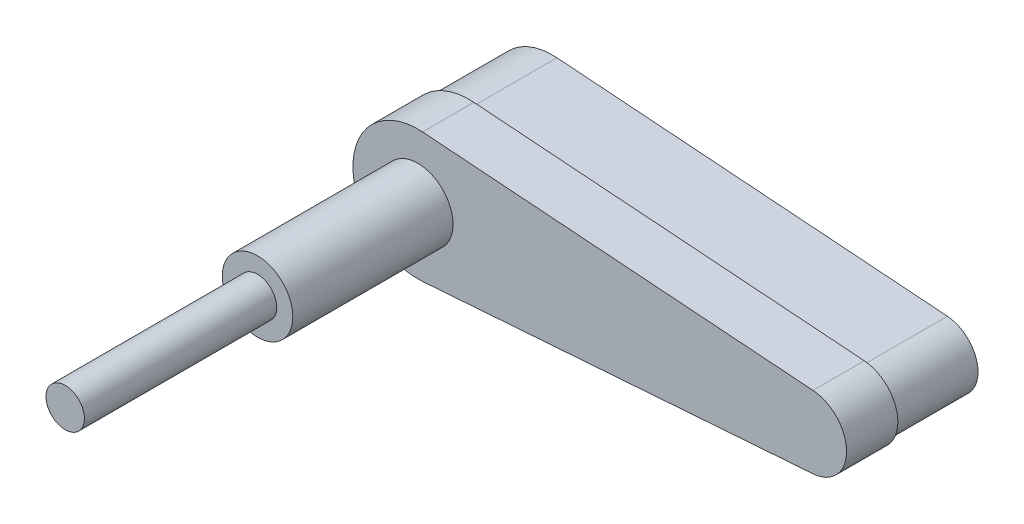
ISO-10303-21;
HEADER;
FILE_DESCRIPTION(('STEP AP214'),'2;1');
FILE_NAME('part.step','',(''),(''),'','','');
FILE_SCHEMA(('AUTOMOTIVE_DESIGN { 1 0 10303 214 1 1 1 1 }'));
ENDSEC;
DATA;
#1=APPLICATION_CONTEXT('core data for automotive mechanical design processes');
#2=APPLICATION_PROTOCOL_DEFINITION('international standard','automotive_design',2000,#1);
#3=PRODUCT_CONTEXT('',#1,'mechanical');
#4=PRODUCT('Part','Part','',(#3));
#5=PRODUCT_RELATED_PRODUCT_CATEGORY('part','',(#4));
#6=PRODUCT_DEFINITION_FORMATION('','',#4);
#7=PRODUCT_DEFINITION_CONTEXT('part definition',#1,'design');
#8=PRODUCT_DEFINITION('design','',#6,#7);
#9=PRODUCT_DEFINITION_SHAPE('','',#8);
#10=(LENGTH_UNIT() NAMED_UNIT(*) SI_UNIT(.MILLI.,.METRE.));
#11=(NAMED_UNIT(*) PLANE_ANGLE_UNIT() SI_UNIT($,.RADIAN.));
#12=(NAMED_UNIT(*) SI_UNIT($,.STERADIAN.) SOLID_ANGLE_UNIT());
#13=UNCERTAINTY_MEASURE_WITH_UNIT(LENGTH_MEASURE(1.E-05),#10,'distance_accuracy_value','');
#14=(GEOMETRIC_REPRESENTATION_CONTEXT(3) GLOBAL_UNCERTAINTY_ASSIGNED_CONTEXT((#13)) GLOBAL_UNIT_ASSIGNED_CONTEXT((#10,
#11,#12)) REPRESENTATION_CONTEXT('',''));
#15=CARTESIAN_POINT('',(0.,0.,0.));
#16=DIRECTION('',(0.,0.,1.));
#17=DIRECTION('',(1.,0.,0.));
#18=AXIS2_PLACEMENT_3D('',#15,#16,#17);
#19=CARTESIAN_POINT('',(9.62576122381982,0.,76.));
#20=DIRECTION('',(0.,0.,-1.));
#21=DIRECTION('',(-1.,0.,0.));
#22=AXIS2_PLACEMENT_3D('',#19,#20,#21);
#23=CYLINDRICAL_SURFACE('',#22,5.5);
#24=CARTESIAN_POINT('',(9.62576122381982,0.,21.));
#25=DIRECTION('',(0.,0.,1.));
#26=DIRECTION('',(1.,0.,0.));
#27=AXIS2_PLACEMENT_3D('',#24,#25,#26);
#28=CIRCLE('',#27,5.5);
#29=CARTESIAN_POINT('',(15.1257612238198,0.,21.));
#30=VERTEX_POINT('',#29);
#31=EDGE_CURVE('E211',#30,#30,#28,.T.);
#32=ORIENTED_EDGE('',*,*,#31,.T.);
#33=EDGE_LOOP('',(#32));
#34=FACE_BOUND('',#33,.T.);
#35=CARTESIAN_POINT('',(9.62576122381982,0.,46.));
#36=DIRECTION('',(0.,0.,1.));
#37=DIRECTION('',(1.,0.,0.));
#38=AXIS2_PLACEMENT_3D('',#35,#36,#37);
#39=CIRCLE('',#38,5.5);
#40=CARTESIAN_POINT('',(15.1257612238198,0.,46.));
#41=VERTEX_POINT('',#40);
#42=EDGE_CURVE('E206',#41,#41,#39,.T.);
#43=ORIENTED_EDGE('',*,*,#42,.F.);
#44=EDGE_LOOP('',(#43));
#45=FACE_BOUND('',#44,.T.);
#46=ADVANCED_FACE('F32',(#34,#45),#23,.T.);
#47=CARTESIAN_POINT('',(70.8505161354605,0.,21.));
#48=DIRECTION('',(0.,0.,1.));
#49=DIRECTION('',(1.,0.,0.));
#50=AXIS2_PLACEMENT_3D('',#47,#48,#49);
#51=PLANE('',#50);
#52=CARTESIAN_POINT('',(70.8505161354605,0.,21.));
#53=DIRECTION('',(0.,0.,1.));
#54=DIRECTION('',(1.,0.,0.));
#55=AXIS2_PLACEMENT_3D('',#52,#53,#54);
#56=CIRCLE('',#55,5.64948386453945);
#57=CARTESIAN_POINT('',(71.2635624065474,-5.63436426880912,21.));
#58=VERTEX_POINT('',#57);
#59=CARTESIAN_POINT('',(71.2635624065474,5.63436426880912,21.));
#60=VERTEX_POINT('',#59);
#61=EDGE_CURVE('E117',#58,#60,#56,.T.);
#62=ORIENTED_EDGE('',*,*,#61,.T.);
#63=DIRECTION('',(-0.997323720875594,0.0731122136093564,0.));
#64=VECTOR('',#63,1.);
#65=CARTESIAN_POINT('',(71.2635624065474,5.63436426880912,21.));
#66=LINE('',#65,#64);
#67=CARTESIAN_POINT('',(10.3660780413731,10.0986618604378,21.));
#68=VERTEX_POINT('',#67);
#69=EDGE_CURVE('E106',#60,#68,#66,.T.);
#70=ORIENTED_EDGE('',*,*,#69,.T.);
#71=CARTESIAN_POINT('',(9.62576122381982,0.,21.));
#72=DIRECTION('',(0.,0.,1.));
#73=DIRECTION('',(1.,0.,0.));
#74=AXIS2_PLACEMENT_3D('',#71,#72,#73);
#75=CIRCLE('',#74,10.1257612238198);
#76=CARTESIAN_POINT('',(10.3660780413731,-10.0986618604378,21.));
#77=VERTEX_POINT('',#76);
#78=EDGE_CURVE('E116',#68,#77,#75,.T.);
#79=ORIENTED_EDGE('',*,*,#78,.T.);
#80=DIRECTION('',(0.997323720875594,0.0731122136093564,0.));
#81=VECTOR('',#80,1.);
#82=CARTESIAN_POINT('',(10.3660780413731,-10.0986618604378,21.));
#83=LINE('',#82,#81);
#84=EDGE_CURVE('E123',#77,#58,#83,.T.);
#85=ORIENTED_EDGE('',*,*,#84,.T.);
#86=EDGE_LOOP('',(#62,#70,#79,#85));
#87=FACE_BOUND('',#86,.T.);
#88=ORIENTED_EDGE('',*,*,#31,.F.);
#89=EDGE_LOOP('',(#88));
#90=FACE_BOUND('',#89,.T.);
#91=ADVANCED_FACE('F120',(#87,#90),#51,.T.);
#92=CARTESIAN_POINT('',(9.62576122381982,0.,13.));
#93=DIRECTION('',(0.,0.,-1.));
#94=DIRECTION('',(-1.,0.,0.));
#95=AXIS2_PLACEMENT_3D('',#92,#93,#94);
#96=CYLINDRICAL_SURFACE('',#95,9.62576122381982);
#97=CARTESIAN_POINT('',(9.62576122381982,0.,0.));
#98=DIRECTION('',(0.,0.,1.));
#99=DIRECTION('',(1.,0.,0.));
#100=AXIS2_PLACEMENT_3D('',#97,#98,#99);
#101=CIRCLE('',#100,9.62576122381982);
#102=CARTESIAN_POINT('',(10.3295219345684,9.6,0.));
#103=VERTEX_POINT('',#102);
#104=CARTESIAN_POINT('',(10.3295219345684,-9.6,0.));
#105=VERTEX_POINT('',#104);
#106=EDGE_CURVE('E132',#103,#105,#101,.T.);
#107=ORIENTED_EDGE('',*,*,#106,.T.);
#108=DIRECTION('',(0.,0.,-1.));
#109=VECTOR('',#108,1.);
#110=CARTESIAN_POINT('',(10.3295219345684,-9.6,13.));
#111=LINE('',#110,#109);
#112=CARTESIAN_POINT('',(10.3295219345684,-9.6,13.));
#113=VERTEX_POINT('',#112);
#114=EDGE_CURVE('E11',#113,#105,#111,.T.);
#115=ORIENTED_EDGE('',*,*,#114,.F.);
#116=CARTESIAN_POINT('',(9.62576122381982,0.,13.));
#117=DIRECTION('',(0.,0.,1.));
#118=DIRECTION('',(1.,0.,0.));
#119=AXIS2_PLACEMENT_3D('',#116,#117,#118);
#120=CIRCLE('',#119,9.62576122381982);
#121=CARTESIAN_POINT('',(10.3295219345684,9.6,13.));
#122=VERTEX_POINT('',#121);
#123=EDGE_CURVE('E141',#122,#113,#120,.T.);
#124=ORIENTED_EDGE('',*,*,#123,.F.);
#125=DIRECTION('',(0.,0.,-1.));
#126=VECTOR('',#125,1.);
#127=CARTESIAN_POINT('',(10.3295219345684,9.6,13.));
#128=LINE('',#127,#126);
#129=EDGE_CURVE('E150',#122,#103,#128,.T.);
#130=ORIENTED_EDGE('',*,*,#129,.T.);
#131=EDGE_LOOP('',(#107,#115,#124,#130));
#132=FACE_BOUND('',#131,.T.);
#133=ADVANCED_FACE('F34',(#132),#96,.T.);
#134=CARTESIAN_POINT('',(10.3295219345684,-9.6,13.));
#135=DIRECTION('',(-0.0731122136093564,0.997323720875594,0.));
#136=DIRECTION('',(-0.997323720875594,-0.0731122136093564,0.));
#137=AXIS2_PLACEMENT_3D('',#134,#135,#136);
#138=PLANE('',#137);
#139=DIRECTION('',(0.997323720875594,0.0731122136093564,0.));
#140=VECTOR('',#139,1.);
#141=CARTESIAN_POINT('',(10.3295219345684,-9.6,0.));
#142=LINE('',#141,#140);
#143=CARTESIAN_POINT('',(71.2270062997427,-5.13570240837132,0.));
#144=VERTEX_POINT('',#143);
#145=EDGE_CURVE('E135',#105,#144,#142,.T.);
#146=ORIENTED_EDGE('',*,*,#145,.T.);
#147=DIRECTION('',(0.,0.,-1.));
#148=VECTOR('',#147,1.);
#149=CARTESIAN_POINT('',(71.2270062997427,-5.13570240837132,13.));
#150=LINE('',#149,#148);
#151=CARTESIAN_POINT('',(71.2270062997427,-5.13570240837132,13.));
#152=VERTEX_POINT('',#151);
#153=EDGE_CURVE('E41',#152,#144,#150,.T.);
#154=ORIENTED_EDGE('',*,*,#153,.F.);
#155=DIRECTION('',(0.997323720875594,0.0731122136093564,0.));
#156=VECTOR('',#155,1.);
#157=CARTESIAN_POINT('',(10.3295219345684,-9.6,13.));
#158=LINE('',#157,#156);
#159=EDGE_CURVE('E75',#113,#152,#158,.T.);
#160=ORIENTED_EDGE('',*,*,#159,.F.);
#161=ORIENTED_EDGE('',*,*,#114,.T.);
#162=EDGE_LOOP('',(#146,#154,#160,#161));
#163=FACE_BOUND('',#162,.T.);
#164=ADVANCED_FACE('F240',(#163),#138,.F.);
#165=CARTESIAN_POINT('',(70.8505161354605,0.,13.));
#166=DIRECTION('',(0.,0.,-1.));
#167=DIRECTION('',(-1.,0.,0.));
#168=AXIS2_PLACEMENT_3D('',#165,#166,#167);
#169=CYLINDRICAL_SURFACE('',#168,5.14948386453945);
#170=CARTESIAN_POINT('',(70.8505161354605,0.,0.));
#171=DIRECTION('',(0.,0.,1.));
#172=DIRECTION('',(-1.,0.,0.));
#173=AXIS2_PLACEMENT_3D('',#170,#171,#172);
#174=CIRCLE('',#173,5.14948386453945);
#175=CARTESIAN_POINT('',(71.2270062997427,5.13570240837132,0.));
#176=VERTEX_POINT('',#175);
#177=EDGE_CURVE('E65',#144,#176,#174,.T.);
#178=ORIENTED_EDGE('',*,*,#177,.T.);
#179=DIRECTION('',(0.,0.,-1.));
#180=VECTOR('',#179,1.);
#181=CARTESIAN_POINT('',(71.2270062997427,5.13570240837132,13.));
#182=LINE('',#181,#180);
#183=CARTESIAN_POINT('',(71.2270062997427,5.13570240837132,13.));
#184=VERTEX_POINT('',#183);
#185=EDGE_CURVE('E49',#184,#176,#182,.T.);
#186=ORIENTED_EDGE('',*,*,#185,.F.);
#187=CARTESIAN_POINT('',(70.8505161354605,0.,13.));
#188=DIRECTION('',(0.,0.,1.));
#189=DIRECTION('',(-1.,0.,0.));
#190=AXIS2_PLACEMENT_3D('',#187,#188,#189);
#191=CIRCLE('',#190,5.14948386453945);
#192=EDGE_CURVE('E145',#152,#184,#191,.T.);
#193=ORIENTED_EDGE('',*,*,#192,.F.);
#194=ORIENTED_EDGE('',*,*,#153,.T.);
#195=EDGE_LOOP('',(#178,#186,#193,#194));
#196=FACE_BOUND('',#195,.T.);
#197=ADVANCED_FACE('F156',(#196),#169,.T.);
#198=CARTESIAN_POINT('',(10.3295219345684,9.6,13.));
#199=DIRECTION('',(-0.0731122136093564,-0.997323720875594,0.));
#200=DIRECTION('',(0.997323720875594,-0.0731122136093564,0.));
#201=AXIS2_PLACEMENT_3D('',#198,#199,#200);
#202=PLANE('',#201);
#203=DIRECTION('',(-0.997323720875594,0.0731122136093564,0.));
#204=VECTOR('',#203,1.);
#205=CARTESIAN_POINT('',(10.3295219345684,9.6,0.));
#206=LINE('',#205,#204);
#207=EDGE_CURVE('E70',#176,#103,#206,.T.);
#208=ORIENTED_EDGE('',*,*,#207,.T.);
#209=ORIENTED_EDGE('',*,*,#129,.F.);
#210=DIRECTION('',(-0.997323720875594,0.0731122136093564,0.));
#211=VECTOR('',#210,1.);
#212=CARTESIAN_POINT('',(10.3295219345684,9.6,13.));
#213=LINE('',#212,#211);
#214=EDGE_CURVE('E148',#184,#122,#213,.T.);
#215=ORIENTED_EDGE('',*,*,#214,.F.);
#216=ORIENTED_EDGE('',*,*,#185,.T.);
#217=EDGE_LOOP('',(#208,#209,#215,#216));
#218=FACE_BOUND('',#217,.T.);
#219=ADVANCED_FACE('F161',(#218),#202,.F.);
#220=CARTESIAN_POINT('',(9.62576122381982,0.,0.));
#221=DIRECTION('',(0.,0.,1.));
#222=DIRECTION('',(1.,0.,0.));
#223=AXIS2_PLACEMENT_3D('',#220,#221,#222);
#224=PLANE('',#223);
#225=ORIENTED_EDGE('',*,*,#106,.F.);
#226=ORIENTED_EDGE('',*,*,#207,.F.);
#227=ORIENTED_EDGE('',*,*,#177,.F.);
#228=ORIENTED_EDGE('',*,*,#145,.F.);
#229=EDGE_LOOP('',(#225,#226,#227,#228));
#230=FACE_BOUND('',#229,.T.);
#231=ADVANCED_FACE('F159',(#230),#224,.F.);
#232=CARTESIAN_POINT('',(70.8505161354605,0.,13.));
#233=DIRECTION('',(0.,0.,1.));
#234=DIRECTION('',(1.,0.,0.));
#235=AXIS2_PLACEMENT_3D('',#232,#233,#234);
#236=PLANE('',#235);
#237=CARTESIAN_POINT('',(70.8505161354605,0.,13.));
#238=DIRECTION('',(0.,0.,1.));
#239=DIRECTION('',(1.,0.,0.));
#240=AXIS2_PLACEMENT_3D('',#237,#238,#239);
#241=CIRCLE('',#240,5.64948386453945);
#242=CARTESIAN_POINT('',(71.2635624065474,-5.63436426880912,13.));
#243=VERTEX_POINT('',#242);
#244=CARTESIAN_POINT('',(71.2635624065474,5.63436426880912,13.));
#245=VERTEX_POINT('',#244);
#246=EDGE_CURVE('E131',#243,#245,#241,.T.);
#247=ORIENTED_EDGE('',*,*,#246,.F.);
#248=DIRECTION('',(0.997323720875594,0.0731122136093564,0.));
#249=VECTOR('',#248,1.);
#250=CARTESIAN_POINT('',(10.3660780413731,-10.0986618604378,13.));
#251=LINE('',#250,#249);
#252=CARTESIAN_POINT('',(10.3660780413731,-10.0986618604378,13.));
#253=VERTEX_POINT('',#252);
#254=EDGE_CURVE('E127',#253,#243,#251,.T.);
#255=ORIENTED_EDGE('',*,*,#254,.F.);
#256=CARTESIAN_POINT('',(9.62576122381982,0.,13.));
#257=DIRECTION('',(0.,0.,1.));
#258=DIRECTION('',(1.,0.,0.));
#259=AXIS2_PLACEMENT_3D('',#256,#257,#258);
#260=CIRCLE('',#259,10.1257612238198);
#261=CARTESIAN_POINT('',(10.3660780413731,10.0986618604378,13.));
#262=VERTEX_POINT('',#261);
#263=EDGE_CURVE('E219',#262,#253,#260,.T.);
#264=ORIENTED_EDGE('',*,*,#263,.F.);
#265=DIRECTION('',(-0.997323720875594,0.0731122136093564,0.));
#266=VECTOR('',#265,1.);
#267=CARTESIAN_POINT('',(71.2635624065474,5.63436426880912,13.));
#268=LINE('',#267,#266);
#269=EDGE_CURVE('E217',#245,#262,#268,.T.);
#270=ORIENTED_EDGE('',*,*,#269,.F.);
#271=EDGE_LOOP('',(#247,#255,#264,#270));
#272=FACE_BOUND('',#271,.T.);
#273=ORIENTED_EDGE('',*,*,#214,.T.);
#274=ORIENTED_EDGE('',*,*,#123,.T.);
#275=ORIENTED_EDGE('',*,*,#159,.T.);
#276=ORIENTED_EDGE('',*,*,#192,.T.);
#277=EDGE_LOOP('',(#273,#274,#275,#276));
#278=FACE_BOUND('',#277,.T.);
#279=ADVANCED_FACE('F163',(#272,#278),#236,.F.);
#280=CARTESIAN_POINT('',(70.8505161354605,0.,21.));
#281=DIRECTION('',(0.,0.,-1.));
#282=DIRECTION('',(-1.,0.,0.));
#283=AXIS2_PLACEMENT_3D('',#280,#281,#282);
#284=CYLINDRICAL_SURFACE('',#283,5.64948386453945);
#285=ORIENTED_EDGE('',*,*,#246,.T.);
#286=DIRECTION('',(0.,0.,-1.));
#287=VECTOR('',#286,1.);
#288=CARTESIAN_POINT('',(71.2635624065474,5.63436426880912,21.));
#289=LINE('',#288,#287);
#290=EDGE_CURVE('E110',#60,#245,#289,.T.);
#291=ORIENTED_EDGE('',*,*,#290,.F.);
#292=ORIENTED_EDGE('',*,*,#61,.F.);
#293=DIRECTION('',(0.,0.,-1.));
#294=VECTOR('',#293,1.);
#295=CARTESIAN_POINT('',(71.2635624065474,-5.63436426880912,21.));
#296=LINE('',#295,#294);
#297=EDGE_CURVE('E215',#58,#243,#296,.T.);
#298=ORIENTED_EDGE('',*,*,#297,.T.);
#299=EDGE_LOOP('',(#285,#291,#292,#298));
#300=FACE_BOUND('',#299,.T.);
#301=ADVANCED_FACE('F129',(#300),#284,.T.);
#302=CARTESIAN_POINT('',(71.2635624065474,5.63436426880912,21.));
#303=DIRECTION('',(-0.0731122136093564,-0.997323720875594,0.));
#304=DIRECTION('',(0.997323720875594,-0.0731122136093564,0.));
#305=AXIS2_PLACEMENT_3D('',#302,#303,#304);
#306=PLANE('',#305);
#307=ORIENTED_EDGE('',*,*,#269,.T.);
#308=DIRECTION('',(0.,0.,-1.));
#309=VECTOR('',#308,1.);
#310=CARTESIAN_POINT('',(10.3660780413731,10.0986618604378,21.));
#311=LINE('',#310,#309);
#312=EDGE_CURVE('E113',#68,#262,#311,.T.);
#313=ORIENTED_EDGE('',*,*,#312,.F.);
#314=ORIENTED_EDGE('',*,*,#69,.F.);
#315=ORIENTED_EDGE('',*,*,#290,.T.);
#316=EDGE_LOOP('',(#307,#313,#314,#315));
#317=FACE_BOUND('',#316,.T.);
#318=ADVANCED_FACE('F108',(#317),#306,.F.);
#319=CARTESIAN_POINT('',(9.62576122381982,0.,21.));
#320=DIRECTION('',(0.,0.,-1.));
#321=DIRECTION('',(-1.,0.,0.));
#322=AXIS2_PLACEMENT_3D('',#319,#320,#321);
#323=CYLINDRICAL_SURFACE('',#322,10.1257612238198);
#324=ORIENTED_EDGE('',*,*,#263,.T.);
#325=DIRECTION('',(0.,0.,-1.));
#326=VECTOR('',#325,1.);
#327=CARTESIAN_POINT('',(10.3660780413731,-10.0986618604378,21.));
#328=LINE('',#327,#326);
#329=EDGE_CURVE('E137',#77,#253,#328,.T.);
#330=ORIENTED_EDGE('',*,*,#329,.F.);
#331=ORIENTED_EDGE('',*,*,#78,.F.);
#332=ORIENTED_EDGE('',*,*,#312,.T.);
#333=EDGE_LOOP('',(#324,#330,#331,#332));
#334=FACE_BOUND('',#333,.T.);
#335=ADVANCED_FACE('F228',(#334),#323,.T.);
#336=CARTESIAN_POINT('',(10.3660780413731,-10.0986618604378,21.));
#337=DIRECTION('',(-0.0731122136093564,0.997323720875594,0.));
#338=DIRECTION('',(-0.997323720875594,-0.0731122136093564,0.));
#339=AXIS2_PLACEMENT_3D('',#336,#337,#338);
#340=PLANE('',#339);
#341=ORIENTED_EDGE('',*,*,#254,.T.);
#342=ORIENTED_EDGE('',*,*,#297,.F.);
#343=ORIENTED_EDGE('',*,*,#84,.F.);
#344=ORIENTED_EDGE('',*,*,#329,.T.);
#345=EDGE_LOOP('',(#341,#342,#343,#344));
#346=FACE_BOUND('',#345,.T.);
#347=ADVANCED_FACE('F192',(#346),#340,.F.);
#348=CARTESIAN_POINT('',(9.62576122381982,0.,46.));
#349=DIRECTION('',(0.,0.,1.));
#350=DIRECTION('',(1.,0.,0.));
#351=AXIS2_PLACEMENT_3D('',#348,#349,#350);
#352=PLANE('',#351);
#353=CARTESIAN_POINT('',(9.62576122381982,0.,46.));
#354=DIRECTION('',(0.,0.,1.));
#355=DIRECTION('',(1.,0.,0.));
#356=AXIS2_PLACEMENT_3D('',#353,#354,#355);
#357=CIRCLE('',#356,3.);
#358=CARTESIAN_POINT('',(12.6257612238198,0.,46.));
#359=VERTEX_POINT('',#358);
#360=EDGE_CURVE('E201',#359,#359,#357,.T.);
#361=ORIENTED_EDGE('',*,*,#360,.F.);
#362=EDGE_LOOP('',(#361));
#363=FACE_BOUND('',#362,.T.);
#364=ORIENTED_EDGE('',*,*,#42,.T.);
#365=EDGE_LOOP('',(#364));
#366=FACE_BOUND('',#365,.T.);
#367=ADVANCED_FACE('F189',(#363,#366),#352,.T.);
#368=CARTESIAN_POINT('',(9.62576122381982,0.,46.));
#369=DIRECTION('',(0.,0.,1.));
#370=DIRECTION('',(1.,0.,0.));
#371=AXIS2_PLACEMENT_3D('',#368,#369,#370);
#372=CYLINDRICAL_SURFACE('',#371,3.);
#373=ORIENTED_EDGE('',*,*,#360,.T.);
#374=EDGE_LOOP('',(#373));
#375=FACE_BOUND('',#374,.T.);
#376=CARTESIAN_POINT('',(9.62576122381982,0.,76.));
#377=DIRECTION('',(0.,0.,1.));
#378=DIRECTION('',(1.,0.,0.));
#379=AXIS2_PLACEMENT_3D('',#376,#377,#378);
#380=CIRCLE('',#379,3.);
#381=CARTESIAN_POINT('',(12.6257612238198,0.,76.));
#382=VERTEX_POINT('',#381);
#383=EDGE_CURVE('E204',#382,#382,#380,.T.);
#384=ORIENTED_EDGE('',*,*,#383,.F.);
#385=EDGE_LOOP('',(#384));
#386=FACE_BOUND('',#385,.T.);
#387=ADVANCED_FACE('F187',(#375,#386),#372,.T.);
#388=CARTESIAN_POINT('',(9.62576122381982,0.,76.));
#389=DIRECTION('',(0.,0.,1.));
#390=DIRECTION('',(1.,0.,0.));
#391=AXIS2_PLACEMENT_3D('',#388,#389,#390);
#392=PLANE('',#391);
#393=ORIENTED_EDGE('',*,*,#383,.T.);
#394=EDGE_LOOP('',(#393));
#395=FACE_BOUND('',#394,.T.);
#396=ADVANCED_FACE('F184',(#395),#392,.T.);
#397=CLOSED_SHELL('',(#46,#91,#133,#164,#197,#219,#231,#279,#301,#318,#335,#347,#367,#387,#396));
#398=MANIFOLD_SOLID_BREP('B2',#397);
#399=ADVANCED_BREP_SHAPE_REPRESENTATION('',(#18,#398),#14);
#400=SHAPE_DEFINITION_REPRESENTATION(#9,#399);
ENDSEC;
END-ISO-10303-21;
